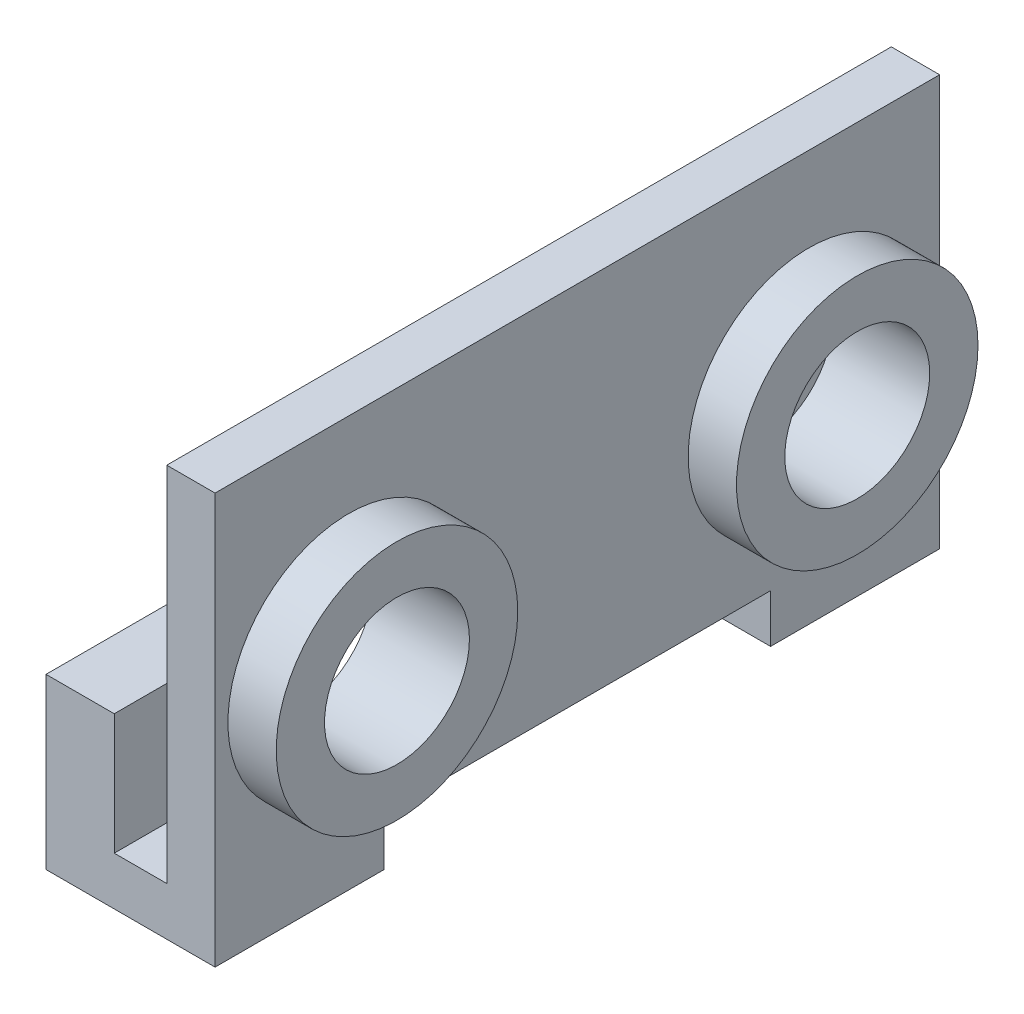
ISO-10303-21;
HEADER;
FILE_DESCRIPTION(('STEP AP214'),'2;1');
FILE_NAME('part.step','',(''),(''),'','','');
FILE_SCHEMA(('AUTOMOTIVE_DESIGN { 1 0 10303 214 1 1 1 1 }'));
ENDSEC;
DATA;
#1=APPLICATION_CONTEXT('core data for automotive mechanical design processes');
#2=APPLICATION_PROTOCOL_DEFINITION('international standard','automotive_design',2000,#1);
#3=PRODUCT_CONTEXT('',#1,'mechanical');
#4=PRODUCT('Part','Part','',(#3));
#5=PRODUCT_RELATED_PRODUCT_CATEGORY('part','',(#4));
#6=PRODUCT_DEFINITION_FORMATION('','',#4);
#7=PRODUCT_DEFINITION_CONTEXT('part definition',#1,'design');
#8=PRODUCT_DEFINITION('design','',#6,#7);
#9=PRODUCT_DEFINITION_SHAPE('','',#8);
#10=(LENGTH_UNIT() NAMED_UNIT(*) SI_UNIT(.MILLI.,.METRE.));
#11=(NAMED_UNIT(*) PLANE_ANGLE_UNIT() SI_UNIT($,.RADIAN.));
#12=(NAMED_UNIT(*) SI_UNIT($,.STERADIAN.) SOLID_ANGLE_UNIT());
#13=UNCERTAINTY_MEASURE_WITH_UNIT(LENGTH_MEASURE(1.E-05),#10,'distance_accuracy_value','');
#14=(GEOMETRIC_REPRESENTATION_CONTEXT(3) GLOBAL_UNCERTAINTY_ASSIGNED_CONTEXT((#13)) GLOBAL_UNIT_ASSIGNED_CONTEXT((#10,
#11,#12)) REPRESENTATION_CONTEXT('',''));
#15=CARTESIAN_POINT('',(0.,0.,0.));
#16=DIRECTION('',(0.,0.,1.));
#17=DIRECTION('',(1.,0.,0.));
#18=AXIS2_PLACEMENT_3D('',#15,#16,#17);
#19=CARTESIAN_POINT('',(-5.,-6.5,-15.));
#20=DIRECTION('',(0.,-1.,0.));
#21=DIRECTION('',(0.,0.,-1.));
#22=AXIS2_PLACEMENT_3D('',#19,#20,#21);
#23=PLANE('',#22);
#24=DIRECTION('',(0.,0.,-1.));
#25=VECTOR('',#24,1.);
#26=CARTESIAN_POINT('',(-2.17413559101942,-6.5,-15.));
#27=LINE('',#26,#25);
#28=CARTESIAN_POINT('',(-2.17413559101942,-6.5,-8.));
#29=VERTEX_POINT('',#28);
#30=CARTESIAN_POINT('',(-2.17413559101942,-6.5,-15.));
#31=VERTEX_POINT('',#30);
#32=EDGE_CURVE('E183',#29,#31,#27,.T.);
#33=ORIENTED_EDGE('',*,*,#32,.F.);
#34=DIRECTION('',(1.,0.,0.));
#35=VECTOR('',#34,1.);
#36=CARTESIAN_POINT('',(-5.,-6.5,-8.));
#37=LINE('',#36,#35);
#38=CARTESIAN_POINT('',(0.,-6.5,-8.));
#39=VERTEX_POINT('',#38);
#40=EDGE_CURVE('E213',#29,#39,#37,.T.);
#41=ORIENTED_EDGE('',*,*,#40,.T.);
#42=DIRECTION('',(0.,0.,-1.));
#43=VECTOR('',#42,1.);
#44=CARTESIAN_POINT('',(0.,-6.5,-15.));
#45=LINE('',#44,#43);
#46=CARTESIAN_POINT('',(0.,-6.5,-15.));
#47=VERTEX_POINT('',#46);
#48=EDGE_CURVE('E200',#39,#47,#45,.T.);
#49=ORIENTED_EDGE('',*,*,#48,.T.);
#50=DIRECTION('',(1.,0.,0.));
#51=VECTOR('',#50,1.);
#52=CARTESIAN_POINT('',(-5.,-6.5,-15.));
#53=LINE('',#52,#51);
#54=EDGE_CURVE('E209',#31,#47,#53,.T.);
#55=ORIENTED_EDGE('',*,*,#54,.F.);
#56=EDGE_LOOP('',(#33,#41,#49,#55));
#57=FACE_BOUND('',#56,.T.);
#58=ADVANCED_FACE('F33',(#57),#23,.F.);
#59=CARTESIAN_POINT('',(0.,0.,0.));
#60=DIRECTION('',(1.,0.,0.));
#61=DIRECTION('',(0.,0.,-1.));
#62=AXIS2_PLACEMENT_3D('',#59,#60,#61);
#63=PLANE('',#62);
#64=CARTESIAN_POINT('',(0.,0.,-9.58862249274262));
#65=DIRECTION('',(1.,0.,0.));
#66=DIRECTION('',(0.,0.,-1.));
#67=AXIS2_PLACEMENT_3D('',#64,#65,#66);
#68=CIRCLE('',#67,3.);
#69=CARTESIAN_POINT('',(0.,0.,-12.5886224927426));
#70=VERTEX_POINT('',#69);
#71=EDGE_CURVE('E237',#70,#70,#68,.T.);
#72=ORIENTED_EDGE('',*,*,#71,.T.);
#73=EDGE_LOOP('',(#72));
#74=FACE_BOUND('',#73,.T.);
#75=CARTESIAN_POINT('',(0.,0.,9.46784622414043));
#76=DIRECTION('',(1.,0.,0.));
#77=DIRECTION('',(0.,0.,-1.));
#78=AXIS2_PLACEMENT_3D('',#75,#76,#77);
#79=CIRCLE('',#78,3.);
#80=CARTESIAN_POINT('',(0.,0.,6.46784622414043));
#81=VERTEX_POINT('',#80);
#82=EDGE_CURVE('E243',#81,#81,#79,.T.);
#83=ORIENTED_EDGE('',*,*,#82,.T.);
#84=EDGE_LOOP('',(#83));
#85=FACE_BOUND('',#84,.T.);
#86=DIRECTION('',(0.,0.,-1.));
#87=VECTOR('',#86,1.);
#88=CARTESIAN_POINT('',(0.,-6.5,8.));
#89=LINE('',#88,#87);
#90=CARTESIAN_POINT('',(0.,-6.5,8.));
#91=VERTEX_POINT('',#90);
#92=EDGE_CURVE('E230',#91,#39,#89,.T.);
#93=ORIENTED_EDGE('',*,*,#92,.F.);
#94=DIRECTION('',(0.,0.,1.));
#95=VECTOR('',#94,1.);
#96=CARTESIAN_POINT('',(0.,-6.5,15.));
#97=LINE('',#96,#95);
#98=CARTESIAN_POINT('',(0.,-6.5,15.));
#99=VERTEX_POINT('',#98);
#100=EDGE_CURVE('E152',#91,#99,#97,.T.);
#101=ORIENTED_EDGE('',*,*,#100,.T.);
#102=DIRECTION('',(0.,-1.,0.));
#103=VECTOR('',#102,1.);
#104=CARTESIAN_POINT('',(0.,8.5,15.));
#105=LINE('',#104,#103);
#106=CARTESIAN_POINT('',(0.,8.5,15.));
#107=VERTEX_POINT('',#106);
#108=EDGE_CURVE('E265',#107,#99,#105,.T.);
#109=ORIENTED_EDGE('',*,*,#108,.F.);
#110=DIRECTION('',(0.,0.,1.));
#111=VECTOR('',#110,1.);
#112=CARTESIAN_POINT('',(0.,8.5,15.));
#113=LINE('',#112,#111);
#114=CARTESIAN_POINT('',(0.,8.5,-15.));
#115=VERTEX_POINT('',#114);
#116=EDGE_CURVE('E275',#115,#107,#113,.T.);
#117=ORIENTED_EDGE('',*,*,#116,.F.);
#118=DIRECTION('',(0.,1.,0.));
#119=VECTOR('',#118,1.);
#120=CARTESIAN_POINT('',(0.,8.5,-15.));
#121=LINE('',#120,#119);
#122=EDGE_CURVE('E258',#47,#115,#121,.T.);
#123=ORIENTED_EDGE('',*,*,#122,.F.);
#124=ORIENTED_EDGE('',*,*,#48,.F.);
#125=EDGE_LOOP('',(#93,#101,#109,#117,#123,#124));
#126=FACE_BOUND('',#125,.T.);
#127=ADVANCED_FACE('F288',(#74,#85,#126),#63,.F.);
#128=CARTESIAN_POINT('',(2.,-8.5,15.));
#129=DIRECTION('',(0.,1.,0.));
#130=DIRECTION('',(0.,0.,1.));
#131=AXIS2_PLACEMENT_3D('',#128,#129,#130);
#132=PLANE('',#131);
#133=DIRECTION('',(-1.,0.,0.));
#134=VECTOR('',#133,1.);
#135=CARTESIAN_POINT('',(0.,-8.5,-8.));
#136=LINE('',#135,#134);
#137=CARTESIAN_POINT('',(2.,-8.5,-8.));
#138=VERTEX_POINT('',#137);
#139=CARTESIAN_POINT('',(-5.,-8.5,-8.));
#140=VERTEX_POINT('',#139);
#141=EDGE_CURVE('E215',#138,#140,#136,.T.);
#142=ORIENTED_EDGE('',*,*,#141,.T.);
#143=DIRECTION('',(0.,0.,1.));
#144=VECTOR('',#143,1.);
#145=CARTESIAN_POINT('',(-5.,-8.5,-15.));
#146=LINE('',#145,#144);
#147=CARTESIAN_POINT('',(-5.,-8.5,-15.));
#148=VERTEX_POINT('',#147);
#149=EDGE_CURVE('E204',#148,#140,#146,.T.);
#150=ORIENTED_EDGE('',*,*,#149,.F.);
#151=DIRECTION('',(-1.,0.,0.));
#152=VECTOR('',#151,1.);
#153=CARTESIAN_POINT('',(2.,-8.5,-15.));
#154=LINE('',#153,#152);
#155=CARTESIAN_POINT('',(2.,-8.5,-15.));
#156=VERTEX_POINT('',#155);
#157=EDGE_CURVE('E273',#156,#148,#154,.T.);
#158=ORIENTED_EDGE('',*,*,#157,.F.);
#159=DIRECTION('',(0.,0.,-1.));
#160=VECTOR('',#159,1.);
#161=CARTESIAN_POINT('',(2.,-8.5,15.));
#162=LINE('',#161,#160);
#163=EDGE_CURVE('E269',#138,#156,#162,.T.);
#164=ORIENTED_EDGE('',*,*,#163,.F.);
#165=EDGE_LOOP('',(#142,#150,#158,#164));
#166=FACE_BOUND('',#165,.T.);
#167=ADVANCED_FACE('F323',(#166),#132,.F.);
#168=CARTESIAN_POINT('',(2.,0.,0.));
#169=DIRECTION('',(1.,0.,0.));
#170=DIRECTION('',(0.,0.,-1.));
#171=AXIS2_PLACEMENT_3D('',#168,#169,#170);
#172=PLANE('',#171);
#173=CARTESIAN_POINT('',(2.,0.,9.46784622414043));
#174=DIRECTION('',(1.,0.,0.));
#175=DIRECTION('',(0.,0.,-1.));
#176=AXIS2_PLACEMENT_3D('',#173,#174,#175);
#177=CIRCLE('',#176,5.);
#178=CARTESIAN_POINT('',(2.,0.,4.46784622414043));
#179=VERTEX_POINT('',#178);
#180=EDGE_CURVE('E249',#179,#179,#177,.T.);
#181=ORIENTED_EDGE('',*,*,#180,.F.);
#182=EDGE_LOOP('',(#181));
#183=FACE_BOUND('',#182,.T.);
#184=CARTESIAN_POINT('',(2.,0.,-9.58862249274262));
#185=DIRECTION('',(1.,0.,0.));
#186=DIRECTION('',(0.,0.,-1.));
#187=AXIS2_PLACEMENT_3D('',#184,#185,#186);
#188=CIRCLE('',#187,5.);
#189=CARTESIAN_POINT('',(2.,0.,-14.5886224927426));
#190=VERTEX_POINT('',#189);
#191=EDGE_CURVE('E252',#190,#190,#188,.T.);
#192=ORIENTED_EDGE('',*,*,#191,.F.);
#193=EDGE_LOOP('',(#192));
#194=FACE_BOUND('',#193,.T.);
#195=DIRECTION('',(0.,0.,1.));
#196=VECTOR('',#195,1.);
#197=CARTESIAN_POINT('',(2.,-6.5,8.));
#198=LINE('',#197,#196);
#199=CARTESIAN_POINT('',(2.,-6.5,-8.));
#200=VERTEX_POINT('',#199);
#201=CARTESIAN_POINT('',(2.,-6.5,8.));
#202=VERTEX_POINT('',#201);
#203=EDGE_CURVE('E224',#200,#202,#198,.T.);
#204=ORIENTED_EDGE('',*,*,#203,.F.);
#205=DIRECTION('',(0.,-1.,0.));
#206=VECTOR('',#205,1.);
#207=CARTESIAN_POINT('',(2.,-6.5,-8.));
#208=LINE('',#207,#206);
#209=EDGE_CURVE('E219',#200,#138,#208,.T.);
#210=ORIENTED_EDGE('',*,*,#209,.T.);
#211=ORIENTED_EDGE('',*,*,#163,.T.);
#212=DIRECTION('',(0.,1.,0.));
#213=VECTOR('',#212,1.);
#214=CARTESIAN_POINT('',(2.,8.5,-15.));
#215=LINE('',#214,#213);
#216=CARTESIAN_POINT('',(2.,8.5,-15.));
#217=VERTEX_POINT('',#216);
#218=EDGE_CURVE('E261',#156,#217,#215,.T.);
#219=ORIENTED_EDGE('',*,*,#218,.T.);
#220=DIRECTION('',(0.,0.,1.));
#221=VECTOR('',#220,1.);
#222=CARTESIAN_POINT('',(2.,8.5,15.));
#223=LINE('',#222,#221);
#224=CARTESIAN_POINT('',(2.,8.5,15.));
#225=VERTEX_POINT('',#224);
#226=EDGE_CURVE('E264',#217,#225,#223,.T.);
#227=ORIENTED_EDGE('',*,*,#226,.T.);
#228=DIRECTION('',(0.,-1.,0.));
#229=VECTOR('',#228,1.);
#230=CARTESIAN_POINT('',(2.,8.5,15.));
#231=LINE('',#230,#229);
#232=CARTESIAN_POINT('',(2.,-8.5,15.));
#233=VERTEX_POINT('',#232);
#234=EDGE_CURVE('E267',#225,#233,#231,.T.);
#235=ORIENTED_EDGE('',*,*,#234,.T.);
#236=CARTESIAN_POINT('',(2.,-8.5,8.));
#237=VERTEX_POINT('',#236);
#238=EDGE_CURVE('E270',#233,#237,#162,.T.);
#239=ORIENTED_EDGE('',*,*,#238,.T.);
#240=DIRECTION('',(0.,-1.,0.));
#241=VECTOR('',#240,1.);
#242=CARTESIAN_POINT('',(2.,-6.5,8.));
#243=LINE('',#242,#241);
#244=EDGE_CURVE('E233',#202,#237,#243,.T.);
#245=ORIENTED_EDGE('',*,*,#244,.F.);
#246=EDGE_LOOP('',(#204,#210,#211,#219,#227,#235,#239,#245));
#247=FACE_BOUND('',#246,.T.);
#248=ADVANCED_FACE('F302',(#183,#194,#247),#172,.T.);
#249=CARTESIAN_POINT('',(2.,8.5,-15.));
#250=DIRECTION('',(0.,0.,1.));
#251=DIRECTION('',(0.,-1.,0.));
#252=AXIS2_PLACEMENT_3D('',#249,#250,#251);
#253=PLANE('',#252);
#254=ORIENTED_EDGE('',*,*,#157,.T.);
#255=DIRECTION('',(0.,-1.,0.));
#256=VECTOR('',#255,1.);
#257=CARTESIAN_POINT('',(-5.,-8.5,-15.));
#258=LINE('',#257,#256);
#259=CARTESIAN_POINT('',(-5.,-1.5,-15.));
#260=VERTEX_POINT('',#259);
#261=EDGE_CURVE('E201',#260,#148,#258,.T.);
#262=ORIENTED_EDGE('',*,*,#261,.F.);
#263=DIRECTION('',(-1.,0.,0.));
#264=VECTOR('',#263,1.);
#265=CARTESIAN_POINT('',(-5.,-1.5,-15.));
#266=LINE('',#265,#264);
#267=CARTESIAN_POINT('',(-2.17413559101942,-1.5,-15.));
#268=VERTEX_POINT('',#267);
#269=EDGE_CURVE('E191',#268,#260,#266,.T.);
#270=ORIENTED_EDGE('',*,*,#269,.F.);
#271=DIRECTION('',(0.,-1.,0.));
#272=VECTOR('',#271,1.);
#273=CARTESIAN_POINT('',(-2.17413559101942,-1.5,-15.));
#274=LINE('',#273,#272);
#275=EDGE_CURVE('E194',#268,#31,#274,.T.);
#276=ORIENTED_EDGE('',*,*,#275,.T.);
#277=ORIENTED_EDGE('',*,*,#54,.T.);
#278=ORIENTED_EDGE('',*,*,#122,.T.);
#279=DIRECTION('',(-1.,0.,0.));
#280=VECTOR('',#279,1.);
#281=CARTESIAN_POINT('',(2.,8.5,-15.));
#282=LINE('',#281,#280);
#283=EDGE_CURVE('E11',#217,#115,#282,.T.);
#284=ORIENTED_EDGE('',*,*,#283,.F.);
#285=ORIENTED_EDGE('',*,*,#218,.F.);
#286=EDGE_LOOP('',(#254,#262,#270,#276,#277,#278,#284,#285));
#287=FACE_BOUND('',#286,.T.);
#288=ADVANCED_FACE('F35',(#287),#253,.F.);
#289=CARTESIAN_POINT('',(2.,8.5,15.));
#290=DIRECTION('',(0.,-1.,0.));
#291=DIRECTION('',(0.,0.,-1.));
#292=AXIS2_PLACEMENT_3D('',#289,#290,#291);
#293=PLANE('',#292);
#294=ORIENTED_EDGE('',*,*,#116,.T.);
#295=DIRECTION('',(-1.,0.,0.));
#296=VECTOR('',#295,1.);
#297=CARTESIAN_POINT('',(2.,8.5,15.));
#298=LINE('',#297,#296);
#299=EDGE_CURVE('E41',#225,#107,#298,.T.);
#300=ORIENTED_EDGE('',*,*,#299,.F.);
#301=ORIENTED_EDGE('',*,*,#226,.F.);
#302=ORIENTED_EDGE('',*,*,#283,.T.);
#303=EDGE_LOOP('',(#294,#300,#301,#302));
#304=FACE_BOUND('',#303,.T.);
#305=ADVANCED_FACE('F305',(#304),#293,.F.);
#306=CARTESIAN_POINT('',(2.,8.5,15.));
#307=DIRECTION('',(0.,0.,-1.));
#308=DIRECTION('',(0.,1.,0.));
#309=AXIS2_PLACEMENT_3D('',#306,#307,#308);
#310=PLANE('',#309);
#311=ORIENTED_EDGE('',*,*,#108,.T.);
#312=DIRECTION('',(1.,0.,0.));
#313=VECTOR('',#312,1.);
#314=CARTESIAN_POINT('',(-5.,-6.5,15.));
#315=LINE('',#314,#313);
#316=CARTESIAN_POINT('',(-2.17413559101942,-6.5,15.));
#317=VERTEX_POINT('',#316);
#318=EDGE_CURVE('E181',#317,#99,#315,.T.);
#319=ORIENTED_EDGE('',*,*,#318,.F.);
#320=DIRECTION('',(0.,-1.,0.));
#321=VECTOR('',#320,1.);
#322=CARTESIAN_POINT('',(-2.17413559101942,-1.5,15.));
#323=LINE('',#322,#321);
#324=CARTESIAN_POINT('',(-2.17413559101942,-1.5,15.));
#325=VERTEX_POINT('',#324);
#326=EDGE_CURVE('E166',#325,#317,#323,.T.);
#327=ORIENTED_EDGE('',*,*,#326,.F.);
#328=DIRECTION('',(-1.,0.,0.));
#329=VECTOR('',#328,1.);
#330=CARTESIAN_POINT('',(-5.,-1.5,15.));
#331=LINE('',#330,#329);
#332=CARTESIAN_POINT('',(-5.,-1.5,15.));
#333=VERTEX_POINT('',#332);
#334=EDGE_CURVE('E158',#325,#333,#331,.T.);
#335=ORIENTED_EDGE('',*,*,#334,.T.);
#336=DIRECTION('',(0.,-1.,0.));
#337=VECTOR('',#336,1.);
#338=CARTESIAN_POINT('',(-5.,-8.5,15.));
#339=LINE('',#338,#337);
#340=CARTESIAN_POINT('',(-5.,-8.5,15.));
#341=VERTEX_POINT('',#340);
#342=EDGE_CURVE('E140',#333,#341,#339,.T.);
#343=ORIENTED_EDGE('',*,*,#342,.T.);
#344=DIRECTION('',(-1.,0.,0.));
#345=VECTOR('',#344,1.);
#346=CARTESIAN_POINT('',(2.,-8.5,15.));
#347=LINE('',#346,#345);
#348=EDGE_CURVE('E279',#233,#341,#347,.T.);
#349=ORIENTED_EDGE('',*,*,#348,.F.);
#350=ORIENTED_EDGE('',*,*,#234,.F.);
#351=ORIENTED_EDGE('',*,*,#299,.T.);
#352=EDGE_LOOP('',(#311,#319,#327,#335,#343,#349,#350,#351));
#353=FACE_BOUND('',#352,.T.);
#354=ADVANCED_FACE('F164',(#353),#310,.F.);
#355=ORIENTED_EDGE('',*,*,#348,.T.);
#356=DIRECTION('',(0.,0.,-1.));
#357=VECTOR('',#356,1.);
#358=CARTESIAN_POINT('',(-5.,-8.5,15.));
#359=LINE('',#358,#357);
#360=CARTESIAN_POINT('',(-5.,-8.5,8.));
#361=VERTEX_POINT('',#360);
#362=EDGE_CURVE('E147',#341,#361,#359,.T.);
#363=ORIENTED_EDGE('',*,*,#362,.T.);
#364=DIRECTION('',(-1.,0.,0.));
#365=VECTOR('',#364,1.);
#366=CARTESIAN_POINT('',(0.,-8.5,8.));
#367=LINE('',#366,#365);
#368=EDGE_CURVE('E223',#237,#361,#367,.T.);
#369=ORIENTED_EDGE('',*,*,#368,.F.);
#370=ORIENTED_EDGE('',*,*,#238,.F.);
#371=EDGE_LOOP('',(#355,#363,#369,#370));
#372=FACE_BOUND('',#371,.T.);
#373=ADVANCED_FACE('F298',(#372),#132,.F.);
#374=CARTESIAN_POINT('',(4.,0.,-9.58862249274262));
#375=DIRECTION('',(-1.,0.,0.));
#376=DIRECTION('',(0.,0.,1.));
#377=AXIS2_PLACEMENT_3D('',#374,#375,#376);
#378=CYLINDRICAL_SURFACE('',#377,5.);
#379=CARTESIAN_POINT('',(4.,0.,-9.58862249274262));
#380=DIRECTION('',(1.,0.,0.));
#381=DIRECTION('',(0.,0.,-1.));
#382=AXIS2_PLACEMENT_3D('',#379,#380,#381);
#383=CIRCLE('',#382,5.);
#384=CARTESIAN_POINT('',(4.,0.,-14.5886224927426));
#385=VERTEX_POINT('',#384);
#386=EDGE_CURVE('E255',#385,#385,#383,.T.);
#387=ORIENTED_EDGE('',*,*,#386,.F.);
#388=EDGE_LOOP('',(#387));
#389=FACE_BOUND('',#388,.T.);
#390=ORIENTED_EDGE('',*,*,#191,.T.);
#391=EDGE_LOOP('',(#390));
#392=FACE_BOUND('',#391,.T.);
#393=ADVANCED_FACE('F376',(#389,#392),#378,.T.);
#394=CARTESIAN_POINT('',(4.,0.,-9.58862249274262));
#395=DIRECTION('',(1.,0.,0.));
#396=DIRECTION('',(0.,0.,-1.));
#397=AXIS2_PLACEMENT_3D('',#394,#395,#396);
#398=PLANE('',#397);
#399=CARTESIAN_POINT('',(4.,0.,-9.58862249274262));
#400=DIRECTION('',(1.,0.,0.));
#401=DIRECTION('',(0.,0.,-1.));
#402=AXIS2_PLACEMENT_3D('',#399,#400,#401);
#403=CIRCLE('',#402,3.);
#404=CARTESIAN_POINT('',(4.,0.,-12.5886224927426));
#405=VERTEX_POINT('',#404);
#406=EDGE_CURVE('E236',#405,#405,#403,.T.);
#407=ORIENTED_EDGE('',*,*,#406,.F.);
#408=EDGE_LOOP('',(#407));
#409=FACE_BOUND('',#408,.T.);
#410=ORIENTED_EDGE('',*,*,#386,.T.);
#411=EDGE_LOOP('',(#410));
#412=FACE_BOUND('',#411,.T.);
#413=ADVANCED_FACE('F369',(#409,#412),#398,.T.);
#414=CARTESIAN_POINT('',(4.,0.,9.46784622414043));
#415=DIRECTION('',(-1.,0.,0.));
#416=DIRECTION('',(0.,0.,1.));
#417=AXIS2_PLACEMENT_3D('',#414,#415,#416);
#418=CYLINDRICAL_SURFACE('',#417,5.);
#419=CARTESIAN_POINT('',(4.,0.,9.46784622414043));
#420=DIRECTION('',(1.,0.,0.));
#421=DIRECTION('',(0.,0.,-1.));
#422=AXIS2_PLACEMENT_3D('',#419,#420,#421);
#423=CIRCLE('',#422,5.);
#424=CARTESIAN_POINT('',(4.,0.,4.46784622414043));
#425=VERTEX_POINT('',#424);
#426=EDGE_CURVE('E246',#425,#425,#423,.T.);
#427=ORIENTED_EDGE('',*,*,#426,.F.);
#428=EDGE_LOOP('',(#427));
#429=FACE_BOUND('',#428,.T.);
#430=ORIENTED_EDGE('',*,*,#180,.T.);
#431=EDGE_LOOP('',(#430));
#432=FACE_BOUND('',#431,.T.);
#433=ADVANCED_FACE('F366',(#429,#432),#418,.T.);
#434=CARTESIAN_POINT('',(4.,0.,9.46784622414043));
#435=DIRECTION('',(1.,0.,0.));
#436=DIRECTION('',(0.,0.,-1.));
#437=AXIS2_PLACEMENT_3D('',#434,#435,#436);
#438=PLANE('',#437);
#439=CARTESIAN_POINT('',(4.,0.,9.46784622414043));
#440=DIRECTION('',(1.,0.,0.));
#441=DIRECTION('',(0.,0.,-1.));
#442=AXIS2_PLACEMENT_3D('',#439,#440,#441);
#443=CIRCLE('',#442,3.);
#444=CARTESIAN_POINT('',(4.,0.,6.46784622414043));
#445=VERTEX_POINT('',#444);
#446=EDGE_CURVE('E240',#445,#445,#443,.T.);
#447=ORIENTED_EDGE('',*,*,#446,.F.);
#448=EDGE_LOOP('',(#447));
#449=FACE_BOUND('',#448,.T.);
#450=ORIENTED_EDGE('',*,*,#426,.T.);
#451=EDGE_LOOP('',(#450));
#452=FACE_BOUND('',#451,.T.);
#453=ADVANCED_FACE('F364',(#449,#452),#438,.T.);
#454=CARTESIAN_POINT('',(0.,0.,9.46784622414043));
#455=DIRECTION('',(1.,0.,0.));
#456=DIRECTION('',(0.,0.,-1.));
#457=AXIS2_PLACEMENT_3D('',#454,#455,#456);
#458=CYLINDRICAL_SURFACE('',#457,3.);
#459=ORIENTED_EDGE('',*,*,#82,.F.);
#460=EDGE_LOOP('',(#459));
#461=FACE_BOUND('',#460,.T.);
#462=ORIENTED_EDGE('',*,*,#446,.T.);
#463=EDGE_LOOP('',(#462));
#464=FACE_BOUND('',#463,.T.);
#465=ADVANCED_FACE('F360',(#461,#464),#458,.F.);
#466=CARTESIAN_POINT('',(0.,0.,-9.58862249274262));
#467=DIRECTION('',(1.,0.,0.));
#468=DIRECTION('',(0.,0.,-1.));
#469=AXIS2_PLACEMENT_3D('',#466,#467,#468);
#470=CYLINDRICAL_SURFACE('',#469,3.);
#471=ORIENTED_EDGE('',*,*,#71,.F.);
#472=EDGE_LOOP('',(#471));
#473=FACE_BOUND('',#472,.T.);
#474=ORIENTED_EDGE('',*,*,#406,.T.);
#475=EDGE_LOOP('',(#474));
#476=FACE_BOUND('',#475,.T.);
#477=ADVANCED_FACE('F357',(#473,#476),#470,.F.);
#478=CARTESIAN_POINT('',(0.,-6.5,8.));
#479=DIRECTION('',(0.,0.,1.));
#480=DIRECTION('',(1.,0.,0.));
#481=AXIS2_PLACEMENT_3D('',#478,#479,#480);
#482=PLANE('',#481);
#483=ORIENTED_EDGE('',*,*,#368,.T.);
#484=DIRECTION('',(0.,1.,0.));
#485=VECTOR('',#484,1.);
#486=CARTESIAN_POINT('',(-5.,-8.5,8.));
#487=LINE('',#486,#485);
#488=CARTESIAN_POINT('',(-5.,-1.5,8.));
#489=VERTEX_POINT('',#488);
#490=EDGE_CURVE('E151',#361,#489,#487,.T.);
#491=ORIENTED_EDGE('',*,*,#490,.T.);
#492=DIRECTION('',(1.,0.,0.));
#493=VECTOR('',#492,1.);
#494=CARTESIAN_POINT('',(-5.,-1.5,8.));
#495=LINE('',#494,#493);
#496=CARTESIAN_POINT('',(-2.17413559101942,-1.5,8.));
#497=VERTEX_POINT('',#496);
#498=EDGE_CURVE('E161',#489,#497,#495,.T.);
#499=ORIENTED_EDGE('',*,*,#498,.T.);
#500=DIRECTION('',(0.,-1.,0.));
#501=VECTOR('',#500,1.);
#502=CARTESIAN_POINT('',(-2.17413559101942,-1.5,8.));
#503=LINE('',#502,#501);
#504=CARTESIAN_POINT('',(-2.17413559101942,-6.5,8.));
#505=VERTEX_POINT('',#504);
#506=EDGE_CURVE('E172',#497,#505,#503,.T.);
#507=ORIENTED_EDGE('',*,*,#506,.T.);
#508=DIRECTION('',(1.,0.,0.));
#509=VECTOR('',#508,1.);
#510=CARTESIAN_POINT('',(-5.,-6.5,8.));
#511=LINE('',#510,#509);
#512=EDGE_CURVE('E53',#505,#91,#511,.T.);
#513=ORIENTED_EDGE('',*,*,#512,.T.);
#514=DIRECTION('',(-1.,0.,0.));
#515=VECTOR('',#514,1.);
#516=CARTESIAN_POINT('',(0.,-6.5,8.));
#517=LINE('',#516,#515);
#518=EDGE_CURVE('E227',#202,#91,#517,.T.);
#519=ORIENTED_EDGE('',*,*,#518,.F.);
#520=ORIENTED_EDGE('',*,*,#244,.T.);
#521=EDGE_LOOP('',(#483,#491,#499,#507,#513,#519,#520));
#522=FACE_BOUND('',#521,.T.);
#523=ADVANCED_FACE('F295',(#522),#482,.F.);
#524=CARTESIAN_POINT('',(0.,-6.5,0.));
#525=DIRECTION('',(0.,1.,0.));
#526=DIRECTION('',(0.,0.,1.));
#527=AXIS2_PLACEMENT_3D('',#524,#525,#526);
#528=PLANE('',#527);
#529=ORIENTED_EDGE('',*,*,#92,.T.);
#530=DIRECTION('',(-1.,0.,0.));
#531=VECTOR('',#530,1.);
#532=CARTESIAN_POINT('',(0.,-6.5,-8.));
#533=LINE('',#532,#531);
#534=EDGE_CURVE('E216',#200,#39,#533,.T.);
#535=ORIENTED_EDGE('',*,*,#534,.F.);
#536=ORIENTED_EDGE('',*,*,#203,.T.);
#537=ORIENTED_EDGE('',*,*,#518,.T.);
#538=EDGE_LOOP('',(#529,#535,#536,#537));
#539=FACE_BOUND('',#538,.T.);
#540=ADVANCED_FACE('F319',(#539),#528,.F.);
#541=CARTESIAN_POINT('',(0.,-6.5,-8.));
#542=DIRECTION('',(0.,0.,1.));
#543=DIRECTION('',(1.,0.,0.));
#544=AXIS2_PLACEMENT_3D('',#541,#542,#543);
#545=PLANE('',#544);
#546=ORIENTED_EDGE('',*,*,#141,.F.);
#547=ORIENTED_EDGE('',*,*,#209,.F.);
#548=ORIENTED_EDGE('',*,*,#534,.T.);
#549=ORIENTED_EDGE('',*,*,#40,.F.);
#550=DIRECTION('',(0.,-1.,0.));
#551=VECTOR('',#550,1.);
#552=CARTESIAN_POINT('',(-2.17413559101942,-1.5,-8.));
#553=LINE('',#552,#551);
#554=CARTESIAN_POINT('',(-2.17413559101942,-1.5,-8.));
#555=VERTEX_POINT('',#554);
#556=EDGE_CURVE('E198',#555,#29,#553,.T.);
#557=ORIENTED_EDGE('',*,*,#556,.F.);
#558=DIRECTION('',(1.,0.,0.));
#559=VECTOR('',#558,1.);
#560=CARTESIAN_POINT('',(-5.,-1.5,-8.));
#561=LINE('',#560,#559);
#562=CARTESIAN_POINT('',(-5.,-1.5,-8.));
#563=VERTEX_POINT('',#562);
#564=EDGE_CURVE('E187',#563,#555,#561,.T.);
#565=ORIENTED_EDGE('',*,*,#564,.F.);
#566=DIRECTION('',(0.,1.,0.));
#567=VECTOR('',#566,1.);
#568=CARTESIAN_POINT('',(-5.,-8.5,-8.));
#569=LINE('',#568,#567);
#570=EDGE_CURVE('E207',#140,#563,#569,.T.);
#571=ORIENTED_EDGE('',*,*,#570,.F.);
#572=EDGE_LOOP('',(#546,#547,#548,#549,#557,#565,#571));
#573=FACE_BOUND('',#572,.T.);
#574=ADVANCED_FACE('F313',(#573),#545,.T.);
#575=CARTESIAN_POINT('',(-5.,0.,0.));
#576=DIRECTION('',(1.,0.,0.));
#577=DIRECTION('',(0.,0.,-1.));
#578=AXIS2_PLACEMENT_3D('',#575,#576,#577);
#579=PLANE('',#578);
#580=ORIENTED_EDGE('',*,*,#261,.T.);
#581=ORIENTED_EDGE('',*,*,#149,.T.);
#582=ORIENTED_EDGE('',*,*,#570,.T.);
#583=DIRECTION('',(0.,0.,1.));
#584=VECTOR('',#583,1.);
#585=CARTESIAN_POINT('',(-5.,-1.5,-15.));
#586=LINE('',#585,#584);
#587=EDGE_CURVE('E184',#260,#563,#586,.T.);
#588=ORIENTED_EDGE('',*,*,#587,.F.);
#589=EDGE_LOOP('',(#580,#581,#582,#588));
#590=FACE_BOUND('',#589,.T.);
#591=ADVANCED_FACE('F331',(#590),#579,.F.);
#592=CARTESIAN_POINT('',(-2.17413559101942,-1.5,-15.));
#593=DIRECTION('',(-1.,0.,0.));
#594=DIRECTION('',(0.,0.,1.));
#595=AXIS2_PLACEMENT_3D('',#592,#593,#594);
#596=PLANE('',#595);
#597=ORIENTED_EDGE('',*,*,#32,.T.);
#598=ORIENTED_EDGE('',*,*,#275,.F.);
#599=DIRECTION('',(0.,0.,-1.));
#600=VECTOR('',#599,1.);
#601=CARTESIAN_POINT('',(-2.17413559101942,-1.5,-15.));
#602=LINE('',#601,#600);
#603=EDGE_CURVE('E189',#555,#268,#602,.T.);
#604=ORIENTED_EDGE('',*,*,#603,.F.);
#605=ORIENTED_EDGE('',*,*,#556,.T.);
#606=EDGE_LOOP('',(#597,#598,#604,#605));
#607=FACE_BOUND('',#606,.T.);
#608=ADVANCED_FACE('F334',(#607),#596,.F.);
#609=CARTESIAN_POINT('',(0.,-1.5,0.));
#610=DIRECTION('',(0.,1.,0.));
#611=DIRECTION('',(0.,0.,1.));
#612=AXIS2_PLACEMENT_3D('',#609,#610,#611);
#613=PLANE('',#612);
#614=ORIENTED_EDGE('',*,*,#587,.T.);
#615=ORIENTED_EDGE('',*,*,#564,.T.);
#616=ORIENTED_EDGE('',*,*,#603,.T.);
#617=ORIENTED_EDGE('',*,*,#269,.T.);
#618=EDGE_LOOP('',(#614,#615,#616,#617));
#619=FACE_BOUND('',#618,.T.);
#620=ADVANCED_FACE('F329',(#619),#613,.T.);
#621=CARTESIAN_POINT('',(-5.,-6.5,15.));
#622=DIRECTION('',(0.,1.,0.));
#623=DIRECTION('',(0.,0.,1.));
#624=AXIS2_PLACEMENT_3D('',#621,#622,#623);
#625=PLANE('',#624);
#626=DIRECTION('',(0.,0.,1.));
#627=VECTOR('',#626,1.);
#628=CARTESIAN_POINT('',(-2.17413559101942,-6.5,15.));
#629=LINE('',#628,#627);
#630=EDGE_CURVE('E48',#505,#317,#629,.T.);
#631=ORIENTED_EDGE('',*,*,#630,.T.);
#632=ORIENTED_EDGE('',*,*,#318,.T.);
#633=ORIENTED_EDGE('',*,*,#100,.F.);
#634=ORIENTED_EDGE('',*,*,#512,.F.);
#635=EDGE_LOOP('',(#631,#632,#633,#634));
#636=FACE_BOUND('',#635,.T.);
#637=ADVANCED_FACE('F291',(#636),#625,.T.);
#638=CARTESIAN_POINT('',(-5.,0.,0.));
#639=DIRECTION('',(1.,0.,0.));
#640=DIRECTION('',(0.,0.,1.));
#641=AXIS2_PLACEMENT_3D('',#638,#639,#640);
#642=PLANE('',#641);
#643=ORIENTED_EDGE('',*,*,#342,.F.);
#644=DIRECTION('',(0.,0.,-1.));
#645=VECTOR('',#644,1.);
#646=CARTESIAN_POINT('',(-5.,-1.5,15.));
#647=LINE('',#646,#645);
#648=EDGE_CURVE('E144',#333,#489,#647,.T.);
#649=ORIENTED_EDGE('',*,*,#648,.T.);
#650=ORIENTED_EDGE('',*,*,#490,.F.);
#651=ORIENTED_EDGE('',*,*,#362,.F.);
#652=EDGE_LOOP('',(#643,#649,#650,#651));
#653=FACE_BOUND('',#652,.T.);
#654=ADVANCED_FACE('F142',(#653),#642,.F.);
#655=CARTESIAN_POINT('',(-2.17413559101942,-1.5,15.));
#656=DIRECTION('',(1.,0.,0.));
#657=DIRECTION('',(0.,0.,-1.));
#658=AXIS2_PLACEMENT_3D('',#655,#656,#657);
#659=PLANE('',#658);
#660=ORIENTED_EDGE('',*,*,#630,.F.);
#661=ORIENTED_EDGE('',*,*,#506,.F.);
#662=DIRECTION('',(0.,0.,1.));
#663=VECTOR('',#662,1.);
#664=CARTESIAN_POINT('',(-2.17413559101942,-1.5,15.));
#665=LINE('',#664,#663);
#666=EDGE_CURVE('E167',#497,#325,#665,.T.);
#667=ORIENTED_EDGE('',*,*,#666,.T.);
#668=ORIENTED_EDGE('',*,*,#326,.T.);
#669=EDGE_LOOP('',(#660,#661,#667,#668));
#670=FACE_BOUND('',#669,.T.);
#671=ADVANCED_FACE('F293',(#670),#659,.T.);
#672=CARTESIAN_POINT('',(0.,-1.5,0.));
#673=DIRECTION('',(0.,1.,0.));
#674=DIRECTION('',(0.,0.,-1.));
#675=AXIS2_PLACEMENT_3D('',#672,#673,#674);
#676=PLANE('',#675);
#677=ORIENTED_EDGE('',*,*,#648,.F.);
#678=ORIENTED_EDGE('',*,*,#334,.F.);
#679=ORIENTED_EDGE('',*,*,#666,.F.);
#680=ORIENTED_EDGE('',*,*,#498,.F.);
#681=EDGE_LOOP('',(#677,#678,#679,#680));
#682=FACE_BOUND('',#681,.T.);
#683=ADVANCED_FACE('F156',(#682),#676,.T.);
#684=CLOSED_SHELL('',(#58,#127,#167,#248,#288,#305,#354,#373,#393,#413,#433,#453,#465,#477,#523,
#540,#574,#591,#608,#620,#637,#654,#671,#683));
#685=MANIFOLD_SOLID_BREP('B2',#684);
#686=ADVANCED_BREP_SHAPE_REPRESENTATION('',(#18,#685),#14);
#687=SHAPE_DEFINITION_REPRESENTATION(#9,#686);
ENDSEC;
END-ISO-10303-21;
